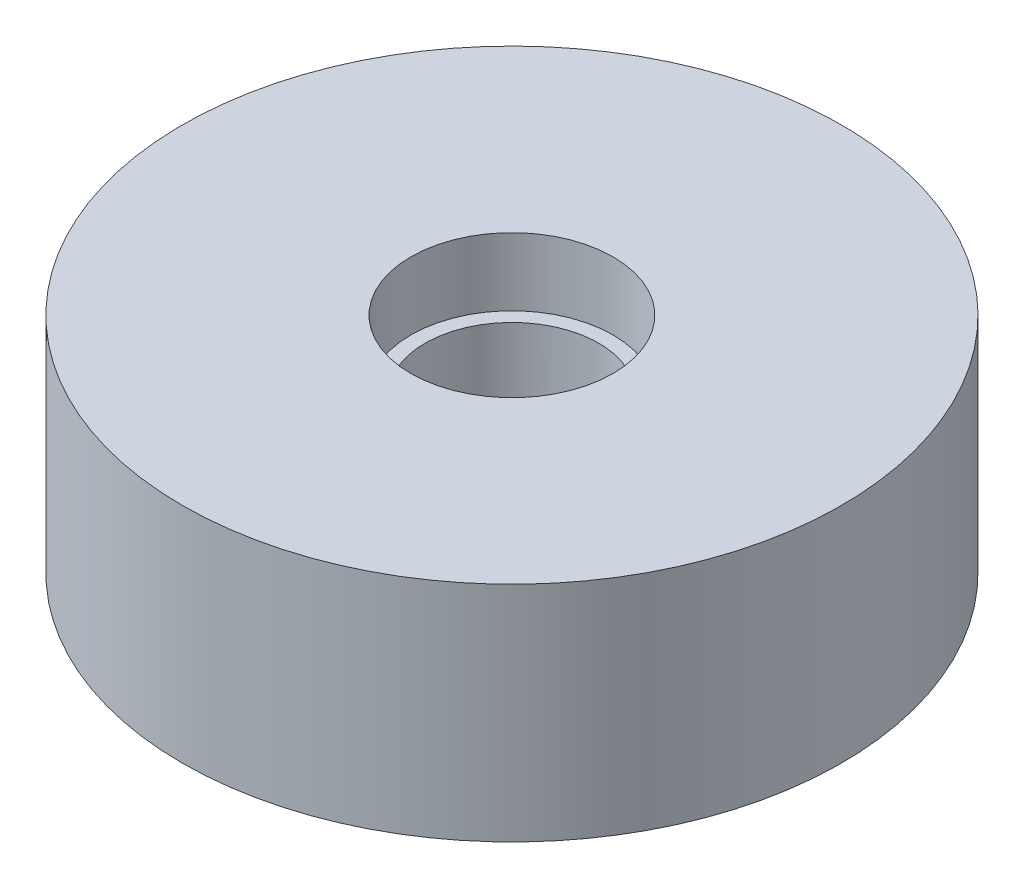
ISO-10303-21;
HEADER;
FILE_DESCRIPTION(('STEP AP214'),'2;1');
FILE_NAME('part.step','',(''),(''),'','','');
FILE_SCHEMA(('AUTOMOTIVE_DESIGN { 1 0 10303 214 1 1 1 1 }'));
ENDSEC;
DATA;
#1=APPLICATION_CONTEXT('core data for automotive mechanical design processes');
#2=APPLICATION_PROTOCOL_DEFINITION('international standard','automotive_design',2000,#1);
#3=PRODUCT_CONTEXT('',#1,'mechanical');
#4=PRODUCT('Part','Part','',(#3));
#5=PRODUCT_RELATED_PRODUCT_CATEGORY('part','',(#4));
#6=PRODUCT_DEFINITION_FORMATION('','',#4);
#7=PRODUCT_DEFINITION_CONTEXT('part definition',#1,'design');
#8=PRODUCT_DEFINITION('design','',#6,#7);
#9=PRODUCT_DEFINITION_SHAPE('','',#8);
#10=(LENGTH_UNIT() NAMED_UNIT(*) SI_UNIT(.MILLI.,.METRE.));
#11=(NAMED_UNIT(*) PLANE_ANGLE_UNIT() SI_UNIT($,.RADIAN.));
#12=(NAMED_UNIT(*) SI_UNIT($,.STERADIAN.) SOLID_ANGLE_UNIT());
#13=UNCERTAINTY_MEASURE_WITH_UNIT(LENGTH_MEASURE(1.E-05),#10,'distance_accuracy_value','');
#14=(GEOMETRIC_REPRESENTATION_CONTEXT(3) GLOBAL_UNCERTAINTY_ASSIGNED_CONTEXT((#13)) GLOBAL_UNIT_ASSIGNED_CONTEXT((#10,
#11,#12)) REPRESENTATION_CONTEXT('',''));
#15=CARTESIAN_POINT('',(0.,0.,0.));
#16=DIRECTION('',(0.,0.,1.));
#17=DIRECTION('',(1.,0.,0.));
#18=AXIS2_PLACEMENT_3D('',#15,#16,#17);
#19=CARTESIAN_POINT('',(0.,0.,0.));
#20=DIRECTION('',(0.,1.,0.));
#21=DIRECTION('',(0.,0.,1.));
#22=AXIS2_PLACEMENT_3D('',#19,#20,#21);
#23=CYLINDRICAL_SURFACE('',#22,9.4361);
#24=CARTESIAN_POINT('',(0.,16.9037,0.));
#25=DIRECTION('',(0.,1.,0.));
#26=DIRECTION('',(0.,0.,1.));
#27=AXIS2_PLACEMENT_3D('',#24,#25,#26);
#28=CIRCLE('',#27,9.4361);
#29=CARTESIAN_POINT('',(0.,16.9037,9.4361));
#30=VERTEX_POINT('',#29);
#31=EDGE_CURVE('E44',#30,#30,#28,.F.);
#32=ORIENTED_EDGE('',*,*,#31,.F.);
#33=EDGE_LOOP('',(#32));
#34=FACE_BOUND('',#33,.T.);
#35=CARTESIAN_POINT('',(0.,7.3533,0.));
#36=DIRECTION('',(0.,-1.,0.));
#37=DIRECTION('',(0.,0.,-1.));
#38=AXIS2_PLACEMENT_3D('',#35,#36,#37);
#39=CIRCLE('',#38,9.4361);
#40=CARTESIAN_POINT('',(0.,7.3533,-9.4361));
#41=VERTEX_POINT('',#40);
#42=EDGE_CURVE('E35',#41,#41,#39,.F.);
#43=ORIENTED_EDGE('',*,*,#42,.F.);
#44=EDGE_LOOP('',(#43));
#45=FACE_BOUND('',#44,.T.);
#46=ADVANCED_FACE('F31',(#34,#45),#23,.F.);
#47=CARTESIAN_POINT('',(0.,24.257,0.));
#48=DIRECTION('',(0.,-1.,0.));
#49=DIRECTION('',(0.,0.,-1.));
#50=AXIS2_PLACEMENT_3D('',#47,#48,#49);
#51=CYLINDRICAL_SURFACE('',#50,35.814);
#52=CARTESIAN_POINT('',(0.,24.257,0.));
#53=DIRECTION('',(0.,1.,0.));
#54=DIRECTION('',(0.,0.,1.));
#55=AXIS2_PLACEMENT_3D('',#52,#53,#54);
#56=CIRCLE('',#55,35.814);
#57=CARTESIAN_POINT('',(0.,24.257,35.814));
#58=VERTEX_POINT('',#57);
#59=EDGE_CURVE('E10',#58,#58,#56,.T.);
#60=ORIENTED_EDGE('',*,*,#59,.F.);
#61=EDGE_LOOP('',(#60));
#62=FACE_BOUND('',#61,.T.);
#63=CARTESIAN_POINT('',(0.,0.,0.));
#64=DIRECTION('',(0.,1.,0.));
#65=DIRECTION('',(0.,0.,1.));
#66=AXIS2_PLACEMENT_3D('',#63,#64,#65);
#67=CIRCLE('',#66,35.814);
#68=CARTESIAN_POINT('',(0.,0.,35.814));
#69=VERTEX_POINT('',#68);
#70=EDGE_CURVE('E39',#69,#69,#67,.T.);
#71=ORIENTED_EDGE('',*,*,#70,.T.);
#72=EDGE_LOOP('',(#71));
#73=FACE_BOUND('',#72,.T.);
#74=ADVANCED_FACE('F33',(#62,#73),#51,.T.);
#75=CARTESIAN_POINT('',(0.,24.257,0.));
#76=DIRECTION('',(0.,1.,0.));
#77=DIRECTION('',(0.,0.,1.));
#78=AXIS2_PLACEMENT_3D('',#75,#76,#77);
#79=PLANE('',#78);
#80=CARTESIAN_POINT('',(0.,24.257,0.));
#81=DIRECTION('',(0.,1.,0.));
#82=DIRECTION('',(0.,0.,1.));
#83=AXIS2_PLACEMENT_3D('',#80,#81,#82);
#84=CIRCLE('',#83,10.9855);
#85=CARTESIAN_POINT('',(0.,24.257,10.9855));
#86=VERTEX_POINT('',#85);
#87=EDGE_CURVE('E47',#86,#86,#84,.T.);
#88=ORIENTED_EDGE('',*,*,#87,.F.);
#89=EDGE_LOOP('',(#88));
#90=FACE_BOUND('',#89,.T.);
#91=ORIENTED_EDGE('',*,*,#59,.T.);
#92=EDGE_LOOP('',(#91));
#93=FACE_BOUND('',#92,.T.);
#94=ADVANCED_FACE('F76',(#90,#93),#79,.T.);
#95=CARTESIAN_POINT('',(0.,0.,0.));
#96=DIRECTION('',(0.,1.,0.));
#97=DIRECTION('',(0.,0.,1.));
#98=AXIS2_PLACEMENT_3D('',#95,#96,#97);
#99=PLANE('',#98);
#100=CARTESIAN_POINT('',(0.,0.,0.));
#101=DIRECTION('',(0.,-1.,0.));
#102=DIRECTION('',(0.,0.,-1.));
#103=AXIS2_PLACEMENT_3D('',#100,#101,#102);
#104=CIRCLE('',#103,10.9855);
#105=CARTESIAN_POINT('',(0.,0.,-10.9855));
#106=VERTEX_POINT('',#105);
#107=EDGE_CURVE('E58',#106,#106,#104,.T.);
#108=ORIENTED_EDGE('',*,*,#107,.F.);
#109=EDGE_LOOP('',(#108));
#110=FACE_BOUND('',#109,.T.);
#111=ORIENTED_EDGE('',*,*,#70,.F.);
#112=EDGE_LOOP('',(#111));
#113=FACE_BOUND('',#112,.T.);
#114=ADVANCED_FACE('F83',(#110,#113),#99,.F.);
#115=CARTESIAN_POINT('',(0.,16.9037,0.));
#116=DIRECTION('',(0.,1.,0.));
#117=DIRECTION('',(0.,0.,1.));
#118=AXIS2_PLACEMENT_3D('',#115,#116,#117);
#119=PLANE('',#118);
#120=CARTESIAN_POINT('',(0.,16.9037,0.));
#121=DIRECTION('',(0.,1.,0.));
#122=DIRECTION('',(0.,0.,1.));
#123=AXIS2_PLACEMENT_3D('',#120,#121,#122);
#124=CIRCLE('',#123,10.9855);
#125=CARTESIAN_POINT('',(0.,16.9037,10.9855));
#126=VERTEX_POINT('',#125);
#127=EDGE_CURVE('E50',#126,#126,#124,.T.);
#128=ORIENTED_EDGE('',*,*,#127,.T.);
#129=EDGE_LOOP('',(#128));
#130=FACE_BOUND('',#129,.T.);
#131=ORIENTED_EDGE('',*,*,#31,.T.);
#132=EDGE_LOOP('',(#131));
#133=FACE_BOUND('',#132,.T.);
#134=ADVANCED_FACE('F86',(#130,#133),#119,.T.);
#135=CARTESIAN_POINT('',(0.,16.9037,0.));
#136=DIRECTION('',(0.,1.,0.));
#137=DIRECTION('',(0.,0.,1.));
#138=AXIS2_PLACEMENT_3D('',#135,#136,#137);
#139=CYLINDRICAL_SURFACE('',#138,10.9855);
#140=CARTESIAN_POINT('',(0.,16.9037,10.9855));
#141=CARTESIAN_POINT('',(0.,16.980296875,10.9855));
#142=CARTESIAN_POINT('',(0.,17.05689375,10.9855));
#143=CARTESIAN_POINT('',(0.,17.2100875,10.9855));
#144=CARTESIAN_POINT('',(0.,17.286684375,10.9855));
#145=CARTESIAN_POINT('',(0.,17.439878125,10.9855));
#146=CARTESIAN_POINT('',(0.,17.516475,10.9855));
#147=CARTESIAN_POINT('',(0.,17.66966875,10.9855));
#148=CARTESIAN_POINT('',(0.,17.746265625,10.9855));
#149=CARTESIAN_POINT('',(0.,17.899459375,10.9855));
#150=CARTESIAN_POINT('',(0.,17.97605625,10.9855));
#151=CARTESIAN_POINT('',(0.,18.12925,10.9855));
#152=CARTESIAN_POINT('',(0.,18.205846875,10.9855));
#153=CARTESIAN_POINT('',(0.,18.359040625,10.9855));
#154=CARTESIAN_POINT('',(0.,18.4356375,10.9855));
#155=CARTESIAN_POINT('',(0.,18.58883125,10.9855));
#156=CARTESIAN_POINT('',(0.,18.665428125,10.9855));
#157=CARTESIAN_POINT('',(0.,18.818621875,10.9855));
#158=CARTESIAN_POINT('',(0.,18.89521875,10.9855));
#159=CARTESIAN_POINT('',(0.,19.0484125,10.9855));
#160=CARTESIAN_POINT('',(0.,19.125009375,10.9855));
#161=CARTESIAN_POINT('',(0.,19.278203125,10.9855));
#162=CARTESIAN_POINT('',(0.,19.3548,10.9855));
#163=CARTESIAN_POINT('',(0.,19.50799375,10.9855));
#164=CARTESIAN_POINT('',(0.,19.584590625,10.9855));
#165=CARTESIAN_POINT('',(0.,19.737784375,10.9855));
#166=CARTESIAN_POINT('',(0.,19.81438125,10.9855));
#167=CARTESIAN_POINT('',(0.,19.967575,10.9855));
#168=CARTESIAN_POINT('',(0.,20.044171875,10.9855));
#169=CARTESIAN_POINT('',(0.,20.197365625,10.9855));
#170=CARTESIAN_POINT('',(0.,20.2739625,10.9855));
#171=CARTESIAN_POINT('',(0.,20.42715625,10.9855));
#172=CARTESIAN_POINT('',(0.,20.503753125,10.9855));
#173=CARTESIAN_POINT('',(0.,20.656946875,10.9855));
#174=CARTESIAN_POINT('',(0.,20.73354375,10.9855));
#175=CARTESIAN_POINT('',(0.,20.8867375,10.9855));
#176=CARTESIAN_POINT('',(0.,20.963334375,10.9855));
#177=CARTESIAN_POINT('',(0.,21.116528125,10.9855));
#178=CARTESIAN_POINT('',(0.,21.193125,10.9855));
#179=CARTESIAN_POINT('',(0.,21.34631875,10.9855));
#180=CARTESIAN_POINT('',(0.,21.422915625,10.9855));
#181=CARTESIAN_POINT('',(0.,21.576109375,10.9855));
#182=CARTESIAN_POINT('',(0.,21.65270625,10.9855));
#183=CARTESIAN_POINT('',(0.,21.8059,10.9855));
#184=CARTESIAN_POINT('',(0.,21.882496875,10.9855));
#185=CARTESIAN_POINT('',(0.,22.035690625,10.9855));
#186=CARTESIAN_POINT('',(0.,22.1122875,10.9855));
#187=CARTESIAN_POINT('',(0.,22.26548125,10.9855));
#188=CARTESIAN_POINT('',(0.,22.342078125,10.9855));
#189=CARTESIAN_POINT('',(0.,22.495271875,10.9855));
#190=CARTESIAN_POINT('',(0.,22.57186875,10.9855));
#191=CARTESIAN_POINT('',(0.,22.7250625,10.9855));
#192=CARTESIAN_POINT('',(0.,22.801659375,10.9855));
#193=CARTESIAN_POINT('',(0.,22.954853125,10.9855));
#194=CARTESIAN_POINT('',(0.,23.03145,10.9855));
#195=CARTESIAN_POINT('',(0.,23.18464375,10.9855));
#196=CARTESIAN_POINT('',(0.,23.261240625,10.9855));
#197=CARTESIAN_POINT('',(0.,23.414434375,10.9855));
#198=CARTESIAN_POINT('',(0.,23.49103125,10.9855));
#199=CARTESIAN_POINT('',(0.,23.644225,10.9855));
#200=CARTESIAN_POINT('',(0.,23.720821875,10.9855));
#201=CARTESIAN_POINT('',(0.,23.874015625,10.9855));
#202=CARTESIAN_POINT('',(0.,23.9506125,10.9855));
#203=CARTESIAN_POINT('',(0.,24.10380625,10.9855));
#204=CARTESIAN_POINT('',(0.,24.180403125,10.9855));
#205=CARTESIAN_POINT('',(0.,24.257,10.9855));
#206=B_SPLINE_CURVE_WITH_KNOTS('',3,(#140,#141,#142,#143,#144,#145,#146,#147,#148,#149,#150,
#151,#152,#153,#154,#155,#156,#157,#158,#159,#160,#161,#162,#163,#164,#165,#166,#167,#168,#169,
#170,#171,#172,#173,#174,#175,#176,#177,#178,#179,#180,#181,#182,#183,#184,#185,#186,#187,#188,
#189,#190,#191,#192,#193,#194,#195,#196,#197,#198,#199,#200,#201,#202,#203,#204,#205),
.UNSPECIFIED.,.F.,.F.,(4,2,2,2,2,2,2,2,2,2,2,2,2,2,2,2,2,2,2,2,2,2,2,2,2,2,2,2,2,2,2,2,4),(0.,
0.229790625,0.45958125,0.689371875000001,0.919162500000001,1.148953125,1.37874375,1.608534375,
1.838325,2.068115625,2.29790625,2.527696875,2.7574875,2.987278125,3.21706875,3.446859375,
3.67665,3.906440625,4.13623125,4.366021875,4.5958125,4.825603125,5.05539375,5.285184375,
5.514975,5.744765625,5.97455625,6.204346875,6.4341375,6.663928125,6.89371875,7.123509375,
7.3533),.UNSPECIFIED.);
#207=EDGE_CURVE('BSEAM80',#126,#86,#206,.T.);
#208=ORIENTED_EDGE('',*,*,#127,.F.);
#209=ORIENTED_EDGE('',*,*,#87,.T.);
#210=ORIENTED_EDGE('',*,*,#207,.T.);
#211=ORIENTED_EDGE('',*,*,#207,.F.);
#212=EDGE_LOOP('',(#208,#210,#209,#211));
#213=FACE_BOUND('',#212,.T.);
#214=ADVANCED_FACE('F80',(#213),#139,.F.);
#215=CARTESIAN_POINT('',(0.,7.3533,0.));
#216=DIRECTION('',(0.,-1.,0.));
#217=DIRECTION('',(0.,0.,-1.));
#218=AXIS2_PLACEMENT_3D('',#215,#216,#217);
#219=PLANE('',#218);
#220=CARTESIAN_POINT('',(0.,7.3533,0.));
#221=DIRECTION('',(0.,-1.,0.));
#222=DIRECTION('',(0.,0.,-1.));
#223=AXIS2_PLACEMENT_3D('',#220,#221,#222);
#224=CIRCLE('',#223,10.9855);
#225=CARTESIAN_POINT('',(0.,7.3533,-10.9855));
#226=VERTEX_POINT('',#225);
#227=EDGE_CURVE('E61',#226,#226,#224,.T.);
#228=ORIENTED_EDGE('',*,*,#227,.T.);
#229=EDGE_LOOP('',(#228));
#230=FACE_BOUND('',#229,.T.);
#231=ORIENTED_EDGE('',*,*,#42,.T.);
#232=EDGE_LOOP('',(#231));
#233=FACE_BOUND('',#232,.T.);
#234=ADVANCED_FACE('F68',(#230,#233),#219,.T.);
#235=CARTESIAN_POINT('',(0.,7.3533,0.));
#236=DIRECTION('',(0.,-1.,0.));
#237=DIRECTION('',(0.,0.,-1.));
#238=AXIS2_PLACEMENT_3D('',#235,#236,#237);
#239=CYLINDRICAL_SURFACE('',#238,10.9855);
#240=CARTESIAN_POINT('',(0.,7.3533,-10.9855));
#241=CARTESIAN_POINT('',(0.,7.276703125,-10.9855));
#242=CARTESIAN_POINT('',(0.,7.20010625,-10.9855));
#243=CARTESIAN_POINT('',(0.,7.0469125,-10.9855));
#244=CARTESIAN_POINT('',(0.,6.970315625,-10.9855));
#245=CARTESIAN_POINT('',(0.,6.817121875,-10.9855));
#246=CARTESIAN_POINT('',(0.,6.740525,-10.9855));
#247=CARTESIAN_POINT('',(0.,6.58733125,-10.9855));
#248=CARTESIAN_POINT('',(0.,6.510734375,-10.9855));
#249=CARTESIAN_POINT('',(0.,6.357540625,-10.9855));
#250=CARTESIAN_POINT('',(0.,6.28094375,-10.9855));
#251=CARTESIAN_POINT('',(0.,6.12775,-10.9855));
#252=CARTESIAN_POINT('',(0.,6.051153125,-10.9855));
#253=CARTESIAN_POINT('',(0.,5.897959375,-10.9855));
#254=CARTESIAN_POINT('',(0.,5.8213625,-10.9855));
#255=CARTESIAN_POINT('',(0.,5.66816875,-10.9855));
#256=CARTESIAN_POINT('',(0.,5.591571875,-10.9855));
#257=CARTESIAN_POINT('',(0.,5.438378125,-10.9855));
#258=CARTESIAN_POINT('',(0.,5.36178125,-10.9855));
#259=CARTESIAN_POINT('',(0.,5.2085875,-10.9855));
#260=CARTESIAN_POINT('',(0.,5.131990625,-10.9855));
#261=CARTESIAN_POINT('',(0.,4.978796875,-10.9855));
#262=CARTESIAN_POINT('',(0.,4.9022,-10.9855));
#263=CARTESIAN_POINT('',(0.,4.74900625,-10.9855));
#264=CARTESIAN_POINT('',(0.,4.672409375,-10.9855));
#265=CARTESIAN_POINT('',(0.,4.519215625,-10.9855));
#266=CARTESIAN_POINT('',(0.,4.44261875,-10.9855));
#267=CARTESIAN_POINT('',(0.,4.289425,-10.9855));
#268=CARTESIAN_POINT('',(0.,4.212828125,-10.9855));
#269=CARTESIAN_POINT('',(0.,4.059634375,-10.9855));
#270=CARTESIAN_POINT('',(0.,3.9830375,-10.9855));
#271=CARTESIAN_POINT('',(0.,3.82984375,-10.9855));
#272=CARTESIAN_POINT('',(0.,3.753246875,-10.9855));
#273=CARTESIAN_POINT('',(0.,3.600053125,-10.9855));
#274=CARTESIAN_POINT('',(0.,3.52345625,-10.9855));
#275=CARTESIAN_POINT('',(0.,3.3702625,-10.9855));
#276=CARTESIAN_POINT('',(0.,3.293665625,-10.9855));
#277=CARTESIAN_POINT('',(0.,3.140471875,-10.9855));
#278=CARTESIAN_POINT('',(0.,3.063875,-10.9855));
#279=CARTESIAN_POINT('',(0.,2.91068125,-10.9855));
#280=CARTESIAN_POINT('',(0.,2.834084375,-10.9855));
#281=CARTESIAN_POINT('',(0.,2.680890625,-10.9855));
#282=CARTESIAN_POINT('',(0.,2.60429375,-10.9855));
#283=CARTESIAN_POINT('',(0.,2.4511,-10.9855));
#284=CARTESIAN_POINT('',(0.,2.374503125,-10.9855));
#285=CARTESIAN_POINT('',(0.,2.221309375,-10.9855));
#286=CARTESIAN_POINT('',(0.,2.1447125,-10.9855));
#287=CARTESIAN_POINT('',(0.,1.99151875,-10.9855));
#288=CARTESIAN_POINT('',(0.,1.914921875,-10.9855));
#289=CARTESIAN_POINT('',(0.,1.761728125,-10.9855));
#290=CARTESIAN_POINT('',(0.,1.68513125,-10.9855));
#291=CARTESIAN_POINT('',(0.,1.5319375,-10.9855));
#292=CARTESIAN_POINT('',(0.,1.455340625,-10.9855));
#293=CARTESIAN_POINT('',(0.,1.302146875,-10.9855));
#294=CARTESIAN_POINT('',(0.,1.22555,-10.9855));
#295=CARTESIAN_POINT('',(0.,1.07235625,-10.9855));
#296=CARTESIAN_POINT('',(0.,0.995759375,-10.9855));
#297=CARTESIAN_POINT('',(0.,0.842565625,-10.9855));
#298=CARTESIAN_POINT('',(0.,0.76596875,-10.9855));
#299=CARTESIAN_POINT('',(0.,0.612775,-10.9855));
#300=CARTESIAN_POINT('',(0.,0.536178125,-10.9855));
#301=CARTESIAN_POINT('',(0.,0.382984375,-10.9855));
#302=CARTESIAN_POINT('',(0.,0.3063875,-10.9855));
#303=CARTESIAN_POINT('',(0.,0.15319375,-10.9855));
#304=CARTESIAN_POINT('',(0.,0.0765968750000002,-10.9855));
#305=CARTESIAN_POINT('',(0.,0.,-10.9855));
#306=B_SPLINE_CURVE_WITH_KNOTS('',3,(#240,#241,#242,#243,#244,#245,#246,#247,#248,#249,#250,
#251,#252,#253,#254,#255,#256,#257,#258,#259,#260,#261,#262,#263,#264,#265,#266,#267,#268,#269,
#270,#271,#272,#273,#274,#275,#276,#277,#278,#279,#280,#281,#282,#283,#284,#285,#286,#287,#288,
#289,#290,#291,#292,#293,#294,#295,#296,#297,#298,#299,#300,#301,#302,#303,#304,#305),
.UNSPECIFIED.,.F.,.F.,(4,2,2,2,2,2,2,2,2,2,2,2,2,2,2,2,2,2,2,2,2,2,2,2,2,2,2,2,2,2,2,2,4),(0.,
0.229790625,0.45958125,0.689371875000001,0.919162500000001,1.148953125,1.37874375,1.608534375,
1.838325,2.068115625,2.29790625,2.527696875,2.7574875,2.987278125,3.21706875,3.446859375,
3.67665,3.906440625,4.13623125,4.366021875,4.5958125,4.825603125,5.05539375,5.285184375,
5.514975,5.744765625,5.97455625,6.204346875,6.4341375,6.663928125,6.89371875,7.123509375,
7.3533),.UNSPECIFIED.);
#307=EDGE_CURVE('BSEAM96',#226,#106,#306,.T.);
#308=ORIENTED_EDGE('',*,*,#227,.F.);
#309=ORIENTED_EDGE('',*,*,#107,.T.);
#310=ORIENTED_EDGE('',*,*,#307,.T.);
#311=ORIENTED_EDGE('',*,*,#307,.F.);
#312=EDGE_LOOP('',(#308,#310,#309,#311));
#313=FACE_BOUND('',#312,.T.);
#314=ADVANCED_FACE('F96',(#313),#239,.F.);
#315=CLOSED_SHELL('',(#46,#74,#94,#114,#134,#214,#234,#314));
#316=MANIFOLD_SOLID_BREP('B2',#315);
#317=ADVANCED_BREP_SHAPE_REPRESENTATION('',(#18,#316),#14);
#318=SHAPE_DEFINITION_REPRESENTATION(#9,#317);
ENDSEC;
END-ISO-10303-21;
